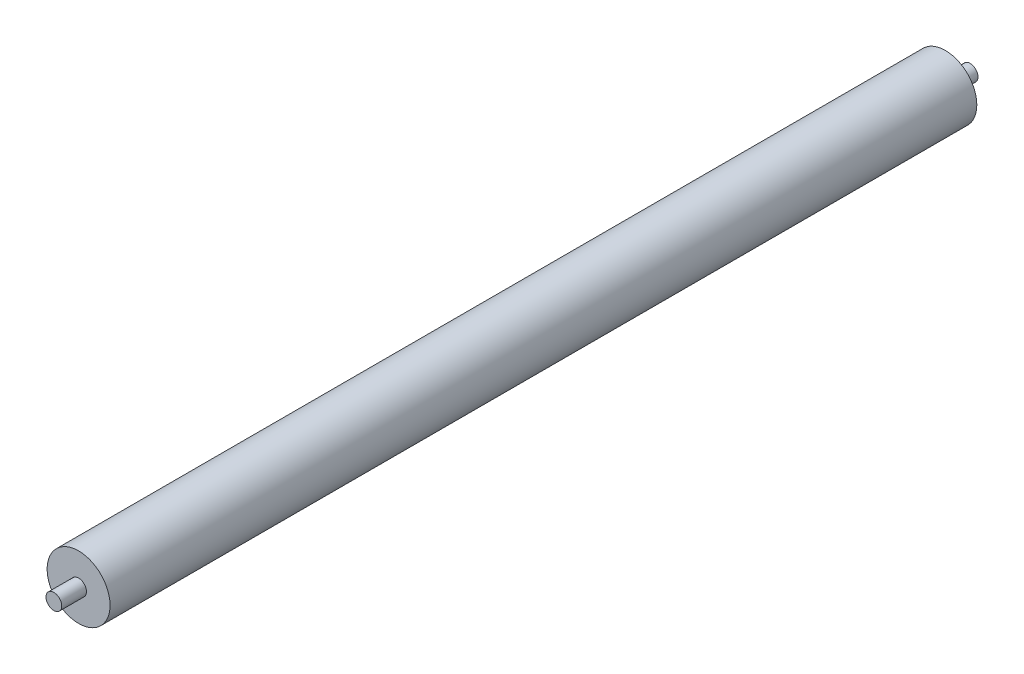
ISO-10303-21;
HEADER;
FILE_DESCRIPTION(('STEP AP214'),'2;1');
FILE_NAME('part.step','',(''),(''),'','','');
FILE_SCHEMA(('AUTOMOTIVE_DESIGN { 1 0 10303 214 1 1 1 1 }'));
ENDSEC;
DATA;
#1=APPLICATION_CONTEXT('core data for automotive mechanical design processes');
#2=APPLICATION_PROTOCOL_DEFINITION('international standard','automotive_design',2000,#1);
#3=PRODUCT_CONTEXT('',#1,'mechanical');
#4=PRODUCT('Part','Part','',(#3));
#5=PRODUCT_RELATED_PRODUCT_CATEGORY('part','',(#4));
#6=PRODUCT_DEFINITION_FORMATION('','',#4);
#7=PRODUCT_DEFINITION_CONTEXT('part definition',#1,'design');
#8=PRODUCT_DEFINITION('design','',#6,#7);
#9=PRODUCT_DEFINITION_SHAPE('','',#8);
#10=(LENGTH_UNIT() NAMED_UNIT(*) SI_UNIT(.MILLI.,.METRE.));
#11=(NAMED_UNIT(*) PLANE_ANGLE_UNIT() SI_UNIT($,.RADIAN.));
#12=(NAMED_UNIT(*) SI_UNIT($,.STERADIAN.) SOLID_ANGLE_UNIT());
#13=UNCERTAINTY_MEASURE_WITH_UNIT(LENGTH_MEASURE(1.E-05),#10,'distance_accuracy_value','');
#14=(GEOMETRIC_REPRESENTATION_CONTEXT(3) GLOBAL_UNCERTAINTY_ASSIGNED_CONTEXT((#13)) GLOBAL_UNIT_ASSIGNED_CONTEXT((#10,
#11,#12)) REPRESENTATION_CONTEXT('',''));
#15=CARTESIAN_POINT('',(0.,0.,0.));
#16=DIRECTION('',(0.,0.,1.));
#17=DIRECTION('',(1.,0.,0.));
#18=AXIS2_PLACEMENT_3D('',#15,#16,#17);
#19=CARTESIAN_POINT('',(0.,0.,350.));
#20=DIRECTION('',(0.,0.,-1.));
#21=DIRECTION('',(-1.,0.,0.));
#22=AXIS2_PLACEMENT_3D('',#19,#20,#21);
#23=CYLINDRICAL_SURFACE('',#22,25.4);
#24=CARTESIAN_POINT('',(0.,0.,350.));
#25=DIRECTION('',(0.,0.,1.));
#26=DIRECTION('',(1.,0.,0.));
#27=AXIS2_PLACEMENT_3D('',#24,#25,#26);
#28=CIRCLE('',#27,25.4);
#29=CARTESIAN_POINT('',(25.4,0.,350.));
#30=VERTEX_POINT('',#29);
#31=EDGE_CURVE('E37',#30,#30,#28,.T.);
#32=ORIENTED_EDGE('',*,*,#31,.F.);
#33=EDGE_LOOP('',(#32));
#34=FACE_BOUND('',#33,.T.);
#35=CARTESIAN_POINT('',(0.,0.,-350.));
#36=DIRECTION('',(0.,0.,1.));
#37=DIRECTION('',(1.,0.,0.));
#38=AXIS2_PLACEMENT_3D('',#35,#36,#37);
#39=CIRCLE('',#38,25.4);
#40=CARTESIAN_POINT('',(25.4,0.,-350.));
#41=VERTEX_POINT('',#40);
#42=EDGE_CURVE('E41',#41,#41,#39,.T.);
#43=ORIENTED_EDGE('',*,*,#42,.T.);
#44=EDGE_LOOP('',(#43));
#45=FACE_BOUND('',#44,.T.);
#46=ADVANCED_FACE('F31',(#34,#45),#23,.T.);
#47=CARTESIAN_POINT('',(0.,0.,350.));
#48=DIRECTION('',(0.,0.,1.));
#49=DIRECTION('',(1.,0.,0.));
#50=AXIS2_PLACEMENT_3D('',#47,#48,#49);
#51=PLANE('',#50);
#52=CARTESIAN_POINT('',(0.,0.,350.));
#53=DIRECTION('',(0.,0.,1.));
#54=DIRECTION('',(1.,0.,0.));
#55=AXIS2_PLACEMENT_3D('',#52,#53,#54);
#56=CIRCLE('',#55,6.35);
#57=CARTESIAN_POINT('',(6.35,0.,350.));
#58=VERTEX_POINT('',#57);
#59=EDGE_CURVE('E46',#58,#58,#56,.F.);
#60=ORIENTED_EDGE('',*,*,#59,.T.);
#61=EDGE_LOOP('',(#60));
#62=FACE_BOUND('',#61,.T.);
#63=ORIENTED_EDGE('',*,*,#31,.T.);
#64=EDGE_LOOP('',(#63));
#65=FACE_BOUND('',#64,.T.);
#66=ADVANCED_FACE('F75',(#62,#65),#51,.T.);
#67=CARTESIAN_POINT('',(0.,0.,-350.));
#68=DIRECTION('',(0.,0.,1.));
#69=DIRECTION('',(1.,0.,0.));
#70=AXIS2_PLACEMENT_3D('',#67,#68,#69);
#71=PLANE('',#70);
#72=CARTESIAN_POINT('',(0.,0.,-350.));
#73=DIRECTION('',(0.,0.,1.));
#74=DIRECTION('',(1.,0.,0.));
#75=AXIS2_PLACEMENT_3D('',#72,#73,#74);
#76=CIRCLE('',#75,6.35);
#77=CARTESIAN_POINT('',(6.35,0.,-350.));
#78=VERTEX_POINT('',#77);
#79=EDGE_CURVE('E10',#78,#78,#76,.F.);
#80=ORIENTED_EDGE('',*,*,#79,.F.);
#81=EDGE_LOOP('',(#80));
#82=FACE_BOUND('',#81,.T.);
#83=ORIENTED_EDGE('',*,*,#42,.F.);
#84=EDGE_LOOP('',(#83));
#85=FACE_BOUND('',#84,.T.);
#86=ADVANCED_FACE('F80',(#82,#85),#71,.F.);
#87=CARTESIAN_POINT('',(0.,0.,-370.));
#88=DIRECTION('',(0.,0.,1.));
#89=DIRECTION('',(1.,0.,0.));
#90=AXIS2_PLACEMENT_3D('',#87,#88,#89);
#91=PLANE('',#90);
#92=CARTESIAN_POINT('',(0.,0.,-370.));
#93=DIRECTION('',(0.,0.,1.));
#94=DIRECTION('',(1.,0.,0.));
#95=AXIS2_PLACEMENT_3D('',#92,#93,#94);
#96=CIRCLE('',#95,6.35);
#97=CARTESIAN_POINT('',(6.35,0.,-370.));
#98=VERTEX_POINT('',#97);
#99=EDGE_CURVE('E51',#98,#98,#96,.T.);
#100=ORIENTED_EDGE('',*,*,#99,.F.);
#101=EDGE_LOOP('',(#100));
#102=FACE_BOUND('',#101,.T.);
#103=ADVANCED_FACE('F69',(#102),#91,.F.);
#104=CARTESIAN_POINT('',(0.,0.,370.));
#105=DIRECTION('',(0.,0.,-1.));
#106=DIRECTION('',(-1.,0.,0.));
#107=AXIS2_PLACEMENT_3D('',#104,#105,#106);
#108=CYLINDRICAL_SURFACE('',#107,6.35);
#109=ORIENTED_EDGE('',*,*,#99,.T.);
#110=EDGE_LOOP('',(#109));
#111=FACE_BOUND('',#110,.T.);
#112=ORIENTED_EDGE('',*,*,#79,.T.);
#113=EDGE_LOOP('',(#112));
#114=FACE_BOUND('',#113,.T.);
#115=ADVANCED_FACE('F61',(#111,#114),#108,.T.);
#116=ORIENTED_EDGE('',*,*,#59,.F.);
#117=EDGE_LOOP('',(#116));
#118=FACE_BOUND('',#117,.T.);
#119=CARTESIAN_POINT('',(0.,0.,370.));
#120=DIRECTION('',(0.,0.,1.));
#121=DIRECTION('',(1.,0.,0.));
#122=AXIS2_PLACEMENT_3D('',#119,#120,#121);
#123=CIRCLE('',#122,6.35);
#124=CARTESIAN_POINT('',(6.35,0.,370.));
#125=VERTEX_POINT('',#124);
#126=EDGE_CURVE('E50',#125,#125,#123,.T.);
#127=ORIENTED_EDGE('',*,*,#126,.F.);
#128=EDGE_LOOP('',(#127));
#129=FACE_BOUND('',#128,.T.);
#130=ADVANCED_FACE('F59',(#118,#129),#108,.T.);
#131=CARTESIAN_POINT('',(0.,0.,370.));
#132=DIRECTION('',(0.,0.,1.));
#133=DIRECTION('',(1.,0.,0.));
#134=AXIS2_PLACEMENT_3D('',#131,#132,#133);
#135=PLANE('',#134);
#136=ORIENTED_EDGE('',*,*,#126,.T.);
#137=EDGE_LOOP('',(#136));
#138=FACE_BOUND('',#137,.T.);
#139=ADVANCED_FACE('F57',(#138),#135,.T.);
#140=CLOSED_SHELL('',(#46,#66,#86,#103,#115,#130,#139));
#141=MANIFOLD_SOLID_BREP('B2',#140);
#142=ADVANCED_BREP_SHAPE_REPRESENTATION('',(#18,#141),#14);
#143=SHAPE_DEFINITION_REPRESENTATION(#9,#142);
ENDSEC;
END-ISO-10303-21;
